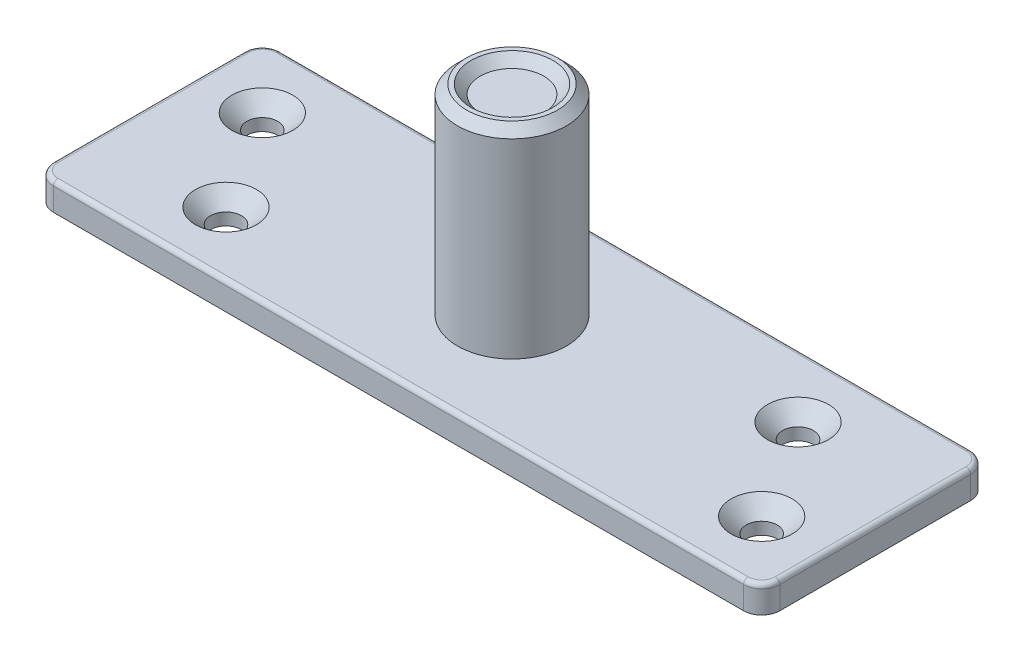
ISO-10303-21;
HEADER;
FILE_DESCRIPTION(('STEP AP214'),'2;1');
FILE_NAME('part.step','',(''),(''),'','','');
FILE_SCHEMA(('AUTOMOTIVE_DESIGN { 1 0 10303 214 1 1 1 1 }'));
ENDSEC;
DATA;
#1=APPLICATION_CONTEXT('core data for automotive mechanical design processes');
#2=APPLICATION_PROTOCOL_DEFINITION('international standard','automotive_design',2000,#1);
#3=PRODUCT_CONTEXT('',#1,'mechanical');
#4=PRODUCT('Part','Part','',(#3));
#5=PRODUCT_RELATED_PRODUCT_CATEGORY('part','',(#4));
#6=PRODUCT_DEFINITION_FORMATION('','',#4);
#7=PRODUCT_DEFINITION_CONTEXT('part definition',#1,'design');
#8=PRODUCT_DEFINITION('design','',#6,#7);
#9=PRODUCT_DEFINITION_SHAPE('','',#8);
#10=(LENGTH_UNIT() NAMED_UNIT(*) SI_UNIT(.MILLI.,.METRE.));
#11=(NAMED_UNIT(*) PLANE_ANGLE_UNIT() SI_UNIT($,.RADIAN.));
#12=(NAMED_UNIT(*) SI_UNIT($,.STERADIAN.) SOLID_ANGLE_UNIT());
#13=UNCERTAINTY_MEASURE_WITH_UNIT(LENGTH_MEASURE(1.E-05),#10,'distance_accuracy_value','');
#14=(GEOMETRIC_REPRESENTATION_CONTEXT(3) GLOBAL_UNCERTAINTY_ASSIGNED_CONTEXT((#13)) GLOBAL_UNIT_ASSIGNED_CONTEXT((#10,
#11,#12)) REPRESENTATION_CONTEXT('',''));
#15=CARTESIAN_POINT('',(0.,0.,0.));
#16=DIRECTION('',(0.,0.,1.));
#17=DIRECTION('',(1.,0.,0.));
#18=AXIS2_PLACEMENT_3D('',#15,#16,#17);
#19=CARTESIAN_POINT('',(0.,23.5,0.));
#20=DIRECTION('',(0.,-1.,0.));
#21=DIRECTION('',(0.,0.,-1.));
#22=AXIS2_PLACEMENT_3D('',#19,#20,#21);
#23=CYLINDRICAL_SURFACE('',#22,6.);
#24=CARTESIAN_POINT('',(0.,-0.5,0.));
#25=DIRECTION('',(0.,-1.,0.));
#26=DIRECTION('',(0.,0.,-1.));
#27=AXIS2_PLACEMENT_3D('',#24,#25,#26);
#28=CIRCLE('',#27,6.);
#29=CARTESIAN_POINT('',(0.,-0.5,-6.));
#30=VERTEX_POINT('',#29);
#31=EDGE_CURVE('E64',#30,#30,#28,.F.);
#32=ORIENTED_EDGE('',*,*,#31,.T.);
#33=EDGE_LOOP('',(#32));
#34=FACE_BOUND('',#33,.T.);
#35=CARTESIAN_POINT('',(0.,22.5,0.));
#36=DIRECTION('',(0.,-1.,0.));
#37=DIRECTION('',(0.,0.,-1.));
#38=AXIS2_PLACEMENT_3D('',#35,#36,#37);
#39=CIRCLE('',#38,6.);
#40=CARTESIAN_POINT('',(0.,22.5,-6.));
#41=VERTEX_POINT('',#40);
#42=EDGE_CURVE('E68',#41,#41,#39,.T.);
#43=ORIENTED_EDGE('',*,*,#42,.T.);
#44=EDGE_LOOP('',(#43));
#45=FACE_BOUND('',#44,.T.);
#46=ADVANCED_FACE('F52',(#34,#45),#23,.T.);
#47=CARTESIAN_POINT('',(0.,23.5,0.));
#48=DIRECTION('',(0.,-1.,0.));
#49=DIRECTION('',(0.,0.,-1.));
#50=AXIS2_PLACEMENT_3D('',#47,#48,#49);
#51=PLANE('',#50);
#52=CARTESIAN_POINT('',(0.,23.5,0.));
#53=DIRECTION('',(0.,1.,0.));
#54=DIRECTION('',(0.,0.,1.));
#55=AXIS2_PLACEMENT_3D('',#52,#53,#54);
#56=CIRCLE('',#55,4.5);
#57=CARTESIAN_POINT('',(0.,23.5,4.5));
#58=VERTEX_POINT('',#57);
#59=EDGE_CURVE('E76',#58,#58,#56,.T.);
#60=ORIENTED_EDGE('',*,*,#59,.F.);
#61=EDGE_LOOP('',(#60));
#62=FACE_BOUND('',#61,.T.);
#63=CARTESIAN_POINT('',(0.,23.5,0.));
#64=DIRECTION('',(0.,-1.,0.));
#65=DIRECTION('',(0.,0.,-1.));
#66=AXIS2_PLACEMENT_3D('',#63,#64,#65);
#67=CIRCLE('',#66,5.);
#68=CARTESIAN_POINT('',(0.,23.5,-5.));
#69=VERTEX_POINT('',#68);
#70=EDGE_CURVE('E60',#69,#69,#67,.F.);
#71=ORIENTED_EDGE('',*,*,#70,.T.);
#72=EDGE_LOOP('',(#71));
#73=FACE_BOUND('',#72,.T.);
#74=ADVANCED_FACE('F82',(#62,#73),#51,.F.);
#75=CARTESIAN_POINT('',(0.,-1.5,0.));
#76=DIRECTION('',(0.,-1.,0.));
#77=DIRECTION('',(0.,0.,-1.));
#78=AXIS2_PLACEMENT_3D('',#75,#76,#77);
#79=PLANE('',#78);
#80=CARTESIAN_POINT('',(0.,-1.5,0.));
#81=DIRECTION('',(0.,-1.,0.));
#82=DIRECTION('',(0.,0.,-1.));
#83=AXIS2_PLACEMENT_3D('',#80,#81,#82);
#84=CIRCLE('',#83,5.00000000000001);
#85=CARTESIAN_POINT('',(0.,-1.5,-5.00000000000001));
#86=VERTEX_POINT('',#85);
#87=EDGE_CURVE('E73',#86,#86,#84,.T.);
#88=ORIENTED_EDGE('',*,*,#87,.T.);
#89=EDGE_LOOP('',(#88));
#90=FACE_BOUND('',#89,.T.);
#91=ADVANCED_FACE('F84',(#90),#79,.T.);
#92=CARTESIAN_POINT('',(0.,-1.5,0.));
#93=DIRECTION('',(0.,1.,0.));
#94=DIRECTION('',(0.,0.,1.));
#95=AXIS2_PLACEMENT_3D('',#92,#93,#94);
#96=CONICAL_SURFACE('',#95,5.,0.785398163397446);
#97=ORIENTED_EDGE('',*,*,#31,.F.);
#98=EDGE_LOOP('',(#97));
#99=FACE_BOUND('',#98,.T.);
#100=ORIENTED_EDGE('',*,*,#87,.F.);
#101=EDGE_LOOP('',(#100));
#102=FACE_BOUND('',#101,.T.);
#103=ADVANCED_FACE('F90',(#99,#102),#96,.T.);
#104=CARTESIAN_POINT('',(0.,22.5,0.));
#105=DIRECTION('',(0.,-1.,0.));
#106=DIRECTION('',(0.,0.,-1.));
#107=AXIS2_PLACEMENT_3D('',#104,#105,#106);
#108=CONICAL_SURFACE('',#107,6.,0.785398163397451);
#109=ORIENTED_EDGE('',*,*,#70,.F.);
#110=EDGE_LOOP('',(#109));
#111=FACE_BOUND('',#110,.T.);
#112=ORIENTED_EDGE('',*,*,#42,.F.);
#113=EDGE_LOOP('',(#112));
#114=FACE_BOUND('',#113,.T.);
#115=ADVANCED_FACE('F103',(#111,#114),#108,.T.);
#116=CARTESIAN_POINT('',(0.,22.5,0.));
#117=DIRECTION('',(0.,1.,0.));
#118=DIRECTION('',(0.,0.,1.));
#119=AXIS2_PLACEMENT_3D('',#116,#117,#118);
#120=PLANE('',#119);
#121=CARTESIAN_POINT('',(0.,22.5,0.));
#122=DIRECTION('',(0.,1.,0.));
#123=DIRECTION('',(0.,0.,1.));
#124=AXIS2_PLACEMENT_3D('',#121,#122,#123);
#125=CIRCLE('',#124,3.49999999999999);
#126=CARTESIAN_POINT('',(0.,22.5,3.49999999999999));
#127=VERTEX_POINT('',#126);
#128=EDGE_CURVE('E11',#127,#127,#125,.T.);
#129=ORIENTED_EDGE('',*,*,#128,.T.);
#130=EDGE_LOOP('',(#129));
#131=FACE_BOUND('',#130,.T.);
#132=ADVANCED_FACE('F96',(#131),#120,.T.);
#133=CARTESIAN_POINT('',(0.,22.5,0.));
#134=DIRECTION('',(0.,1.,0.));
#135=DIRECTION('',(0.,0.,1.));
#136=AXIS2_PLACEMENT_3D('',#133,#134,#135);
#137=CONICAL_SURFACE('',#136,3.49999999999999,0.785398163397452);
#138=ORIENTED_EDGE('',*,*,#59,.T.);
#139=EDGE_LOOP('',(#138));
#140=FACE_BOUND('',#139,.T.);
#141=ORIENTED_EDGE('',*,*,#128,.F.);
#142=EDGE_LOOP('',(#141));
#143=FACE_BOUND('',#142,.T.);
#144=ADVANCED_FACE('F55',(#140,#143),#137,.F.);
#145=CLOSED_SHELL('',(#46,#74,#91,#103,#115,#132,#144));
#146=MANIFOLD_SOLID_BREP('B2',#145);
#147=CARTESIAN_POINT('',(0.,1.5,0.));
#148=DIRECTION('',(0.,-1.,0.));
#149=DIRECTION('',(0.,0.,-1.));
#150=AXIS2_PLACEMENT_3D('',#147,#148,#149);
#151=PLANE('',#150);
#152=DIRECTION('',(0.,0.,1.));
#153=VECTOR('',#152,1.);
#154=CARTESIAN_POINT('',(-39.5,1.5,0.));
#155=LINE('',#154,#153);
#156=CARTESIAN_POINT('',(-39.5,1.5,-10.5));
#157=VERTEX_POINT('',#156);
#158=CARTESIAN_POINT('',(-39.5,1.5,10.5));
#159=VERTEX_POINT('',#158);
#160=EDGE_CURVE('E334',#157,#159,#155,.T.);
#161=ORIENTED_EDGE('',*,*,#160,.T.);
#162=CARTESIAN_POINT('',(-38.,1.5,10.5));
#163=DIRECTION('',(0.,-1.,0.));
#164=DIRECTION('',(0.,0.,-1.));
#165=AXIS2_PLACEMENT_3D('',#162,#163,#164);
#166=CIRCLE('',#165,1.5);
#167=CARTESIAN_POINT('',(-38.,1.5,12.));
#168=VERTEX_POINT('',#167);
#169=EDGE_CURVE('E336',#159,#168,#166,.F.);
#170=ORIENTED_EDGE('',*,*,#169,.T.);
#171=DIRECTION('',(1.,0.,0.));
#172=VECTOR('',#171,1.);
#173=CARTESIAN_POINT('',(0.,1.5,12.));
#174=LINE('',#173,#172);
#175=CARTESIAN_POINT('',(38.,1.5,12.));
#176=VERTEX_POINT('',#175);
#177=EDGE_CURVE('E322',#168,#176,#174,.T.);
#178=ORIENTED_EDGE('',*,*,#177,.T.);
#179=CARTESIAN_POINT('',(38.,1.5,10.5));
#180=DIRECTION('',(0.,-1.,0.));
#181=DIRECTION('',(0.,0.,-1.));
#182=AXIS2_PLACEMENT_3D('',#179,#180,#181);
#183=CIRCLE('',#182,1.5);
#184=CARTESIAN_POINT('',(39.5,1.5,10.5));
#185=VERTEX_POINT('',#184);
#186=EDGE_CURVE('E324',#176,#185,#183,.F.);
#187=ORIENTED_EDGE('',*,*,#186,.T.);
#188=DIRECTION('',(0.,0.,-1.));
#189=VECTOR('',#188,1.);
#190=CARTESIAN_POINT('',(39.5,1.5,0.));
#191=LINE('',#190,#189);
#192=CARTESIAN_POINT('',(39.5,1.5,-10.5));
#193=VERTEX_POINT('',#192);
#194=EDGE_CURVE('E326',#185,#193,#191,.T.);
#195=ORIENTED_EDGE('',*,*,#194,.T.);
#196=CARTESIAN_POINT('',(38.,1.5,-10.5));
#197=DIRECTION('',(0.,-1.,0.));
#198=DIRECTION('',(0.,0.,-1.));
#199=AXIS2_PLACEMENT_3D('',#196,#197,#198);
#200=CIRCLE('',#199,1.5);
#201=CARTESIAN_POINT('',(38.,1.5,-12.));
#202=VERTEX_POINT('',#201);
#203=EDGE_CURVE('E328',#193,#202,#200,.F.);
#204=ORIENTED_EDGE('',*,*,#203,.T.);
#205=DIRECTION('',(-1.,0.,0.));
#206=VECTOR('',#205,1.);
#207=CARTESIAN_POINT('',(0.,1.5,-12.));
#208=LINE('',#207,#206);
#209=CARTESIAN_POINT('',(-38.,1.5,-12.));
#210=VERTEX_POINT('',#209);
#211=EDGE_CURVE('E330',#202,#210,#208,.T.);
#212=ORIENTED_EDGE('',*,*,#211,.T.);
#213=CARTESIAN_POINT('',(-38.,1.5,-10.5));
#214=DIRECTION('',(0.,-1.,0.));
#215=DIRECTION('',(0.,0.,-1.));
#216=AXIS2_PLACEMENT_3D('',#213,#214,#215);
#217=CIRCLE('',#216,1.5);
#218=EDGE_CURVE('E332',#210,#157,#217,.F.);
#219=ORIENTED_EDGE('',*,*,#218,.T.);
#220=EDGE_LOOP('',(#161,#170,#178,#187,#195,#204,#212,#219));
#221=FACE_BOUND('',#220,.T.);
#222=CARTESIAN_POINT('',(-33.,1.5,-5.5));
#223=DIRECTION('',(0.,1.,0.));
#224=DIRECTION('',(0.,0.,1.));
#225=AXIS2_PLACEMENT_3D('',#222,#223,#224);
#226=CIRCLE('',#225,3.36);
#227=CARTESIAN_POINT('',(-33.,1.5,-2.14));
#228=VERTEX_POINT('',#227);
#229=EDGE_CURVE('E372',#228,#228,#226,.T.);
#230=ORIENTED_EDGE('',*,*,#229,.F.);
#231=EDGE_LOOP('',(#230));
#232=FACE_BOUND('',#231,.T.);
#233=CARTESIAN_POINT('',(-26.,1.5,5.5));
#234=DIRECTION('',(0.,1.,0.));
#235=DIRECTION('',(0.,0.,1.));
#236=AXIS2_PLACEMENT_3D('',#233,#234,#235);
#237=CIRCLE('',#236,3.36);
#238=CARTESIAN_POINT('',(-26.,1.5,8.86));
#239=VERTEX_POINT('',#238);
#240=EDGE_CURVE('E387',#239,#239,#237,.T.);
#241=ORIENTED_EDGE('',*,*,#240,.F.);
#242=EDGE_LOOP('',(#241));
#243=FACE_BOUND('',#242,.T.);
#244=CARTESIAN_POINT('',(26.,1.5,-5.5));
#245=DIRECTION('',(0.,1.,0.));
#246=DIRECTION('',(0.,0.,1.));
#247=AXIS2_PLACEMENT_3D('',#244,#245,#246);
#248=CIRCLE('',#247,3.36);
#249=CARTESIAN_POINT('',(26.,1.5,-2.14));
#250=VERTEX_POINT('',#249);
#251=EDGE_CURVE('E396',#250,#250,#248,.T.);
#252=ORIENTED_EDGE('',*,*,#251,.F.);
#253=EDGE_LOOP('',(#252));
#254=FACE_BOUND('',#253,.T.);
#255=CARTESIAN_POINT('',(33.,1.5,5.5));
#256=DIRECTION('',(0.,1.,0.));
#257=DIRECTION('',(0.,0.,1.));
#258=AXIS2_PLACEMENT_3D('',#255,#256,#257);
#259=CIRCLE('',#258,3.36);
#260=CARTESIAN_POINT('',(33.,1.5,8.86));
#261=VERTEX_POINT('',#260);
#262=EDGE_CURVE('E405',#261,#261,#259,.T.);
#263=ORIENTED_EDGE('',*,*,#262,.F.);
#264=EDGE_LOOP('',(#263));
#265=FACE_BOUND('',#264,.T.);
#266=CARTESIAN_POINT('',(0.,1.5,0.));
#267=DIRECTION('',(0.,1.,0.));
#268=DIRECTION('',(0.,0.,1.));
#269=AXIS2_PLACEMENT_3D('',#266,#267,#268);
#270=CIRCLE('',#269,6.);
#271=CARTESIAN_POINT('',(0.,1.5,6.));
#272=VERTEX_POINT('',#271);
#273=EDGE_CURVE('E301',#272,#272,#270,.T.);
#274=ORIENTED_EDGE('',*,*,#273,.F.);
#275=EDGE_LOOP('',(#274));
#276=FACE_BOUND('',#275,.T.);
#277=ADVANCED_FACE('F175',(#221,#232,#243,#254,#265,#276),#151,.F.);
#278=CARTESIAN_POINT('',(0.,-1.5,0.));
#279=DIRECTION('',(0.,-1.,0.));
#280=DIRECTION('',(0.,0.,-1.));
#281=AXIS2_PLACEMENT_3D('',#278,#279,#280);
#282=PLANE('',#281);
#283=CARTESIAN_POINT('',(-33.,-1.5,-5.5));
#284=DIRECTION('',(0.,1.,0.));
#285=DIRECTION('',(0.,0.,1.));
#286=AXIS2_PLACEMENT_3D('',#283,#284,#285);
#287=CIRCLE('',#286,1.7);
#288=CARTESIAN_POINT('',(-33.,-1.5,-3.8));
#289=VERTEX_POINT('',#288);
#290=EDGE_CURVE('E382',#289,#289,#287,.T.);
#291=ORIENTED_EDGE('',*,*,#290,.T.);
#292=EDGE_LOOP('',(#291));
#293=FACE_BOUND('',#292,.T.);
#294=CARTESIAN_POINT('',(-26.,-1.5,5.5));
#295=DIRECTION('',(0.,1.,0.));
#296=DIRECTION('',(0.,0.,1.));
#297=AXIS2_PLACEMENT_3D('',#294,#295,#296);
#298=CIRCLE('',#297,1.7);
#299=CARTESIAN_POINT('',(-26.,-1.5,7.2));
#300=VERTEX_POINT('',#299);
#301=EDGE_CURVE('E393',#300,#300,#298,.T.);
#302=ORIENTED_EDGE('',*,*,#301,.T.);
#303=EDGE_LOOP('',(#302));
#304=FACE_BOUND('',#303,.T.);
#305=CARTESIAN_POINT('',(26.,-1.5,-5.5));
#306=DIRECTION('',(0.,1.,0.));
#307=DIRECTION('',(0.,0.,1.));
#308=AXIS2_PLACEMENT_3D('',#305,#306,#307);
#309=CIRCLE('',#308,1.7);
#310=CARTESIAN_POINT('',(26.,-1.5,-3.8));
#311=VERTEX_POINT('',#310);
#312=EDGE_CURVE('E402',#311,#311,#309,.T.);
#313=ORIENTED_EDGE('',*,*,#312,.T.);
#314=EDGE_LOOP('',(#313));
#315=FACE_BOUND('',#314,.T.);
#316=CARTESIAN_POINT('',(33.,-1.5,5.5));
#317=DIRECTION('',(0.,1.,0.));
#318=DIRECTION('',(0.,0.,1.));
#319=AXIS2_PLACEMENT_3D('',#316,#317,#318);
#320=CIRCLE('',#319,1.7);
#321=CARTESIAN_POINT('',(33.,-1.5,7.2));
#322=VERTEX_POINT('',#321);
#323=EDGE_CURVE('E411',#322,#322,#320,.T.);
#324=ORIENTED_EDGE('',*,*,#323,.T.);
#325=EDGE_LOOP('',(#324));
#326=FACE_BOUND('',#325,.T.);
#327=DIRECTION('',(-1.,0.,0.));
#328=VECTOR('',#327,1.);
#329=CARTESIAN_POINT('',(-40.,-1.5,-12.5));
#330=LINE('',#329,#328);
#331=CARTESIAN_POINT('',(38.,-1.5,-12.5));
#332=VERTEX_POINT('',#331);
#333=CARTESIAN_POINT('',(-38.,-1.5,-12.5));
#334=VERTEX_POINT('',#333);
#335=EDGE_CURVE('E271',#332,#334,#330,.T.);
#336=ORIENTED_EDGE('',*,*,#335,.F.);
#337=CARTESIAN_POINT('',(38.,-1.5,-10.5));
#338=DIRECTION('',(0.,-1.,0.));
#339=DIRECTION('',(0.,0.,-1.));
#340=AXIS2_PLACEMENT_3D('',#337,#338,#339);
#341=CIRCLE('',#340,2.);
#342=CARTESIAN_POINT('',(40.,-1.5,-10.5));
#343=VERTEX_POINT('',#342);
#344=EDGE_CURVE('E281',#332,#343,#341,.T.);
#345=ORIENTED_EDGE('',*,*,#344,.T.);
#346=DIRECTION('',(0.,0.,-1.));
#347=VECTOR('',#346,1.);
#348=CARTESIAN_POINT('',(40.,-1.5,12.5));
#349=LINE('',#348,#347);
#350=CARTESIAN_POINT('',(40.,-1.5,10.5));
#351=VERTEX_POINT('',#350);
#352=EDGE_CURVE('E296',#351,#343,#349,.T.);
#353=ORIENTED_EDGE('',*,*,#352,.F.);
#354=CARTESIAN_POINT('',(38.,-1.5,10.5));
#355=DIRECTION('',(0.,-1.,0.));
#356=DIRECTION('',(0.,0.,-1.));
#357=AXIS2_PLACEMENT_3D('',#354,#355,#356);
#358=CIRCLE('',#357,2.);
#359=CARTESIAN_POINT('',(38.,-1.5,12.5));
#360=VERTEX_POINT('',#359);
#361=EDGE_CURVE('E288',#351,#360,#358,.T.);
#362=ORIENTED_EDGE('',*,*,#361,.T.);
#363=DIRECTION('',(1.,0.,0.));
#364=VECTOR('',#363,1.);
#365=CARTESIAN_POINT('',(-40.,-1.5,12.5));
#366=LINE('',#365,#364);
#367=CARTESIAN_POINT('',(-38.,-1.5,12.5));
#368=VERTEX_POINT('',#367);
#369=EDGE_CURVE('E299',#368,#360,#366,.T.);
#370=ORIENTED_EDGE('',*,*,#369,.F.);
#371=CARTESIAN_POINT('',(-38.,-1.5,10.5));
#372=DIRECTION('',(0.,-1.,0.));
#373=DIRECTION('',(0.,0.,-1.));
#374=AXIS2_PLACEMENT_3D('',#371,#372,#373);
#375=CIRCLE('',#374,2.);
#376=CARTESIAN_POINT('',(-40.,-1.5,10.5));
#377=VERTEX_POINT('',#376);
#378=EDGE_CURVE('E277',#368,#377,#375,.T.);
#379=ORIENTED_EDGE('',*,*,#378,.T.);
#380=DIRECTION('',(0.,0.,1.));
#381=VECTOR('',#380,1.);
#382=CARTESIAN_POINT('',(-40.,-1.5,12.5));
#383=LINE('',#382,#381);
#384=CARTESIAN_POINT('',(-40.,-1.5,-10.5));
#385=VERTEX_POINT('',#384);
#386=EDGE_CURVE('E295',#385,#377,#383,.T.);
#387=ORIENTED_EDGE('',*,*,#386,.F.);
#388=CARTESIAN_POINT('',(-38.,-1.5,-10.5));
#389=DIRECTION('',(0.,-1.,0.));
#390=DIRECTION('',(0.,0.,-1.));
#391=AXIS2_PLACEMENT_3D('',#388,#389,#390);
#392=CIRCLE('',#391,2.);
#393=EDGE_CURVE('E294',#385,#334,#392,.T.);
#394=ORIENTED_EDGE('',*,*,#393,.T.);
#395=EDGE_LOOP('',(#336,#345,#353,#362,#370,#379,#387,#394));
#396=FACE_BOUND('',#395,.T.);
#397=CARTESIAN_POINT('',(0.,-1.5,0.));
#398=DIRECTION('',(0.,1.,0.));
#399=DIRECTION('',(0.,0.,1.));
#400=AXIS2_PLACEMENT_3D('',#397,#398,#399);
#401=CIRCLE('',#400,6.);
#402=CARTESIAN_POINT('',(0.,-1.5,6.));
#403=VERTEX_POINT('',#402);
#404=EDGE_CURVE('E414',#403,#403,#401,.T.);
#405=ORIENTED_EDGE('',*,*,#404,.T.);
#406=EDGE_LOOP('',(#405));
#407=FACE_BOUND('',#406,.T.);
#408=ADVANCED_FACE('F290',(#293,#304,#315,#326,#396,#407),#282,.T.);
#409=CARTESIAN_POINT('',(40.,1.5,12.5));
#410=DIRECTION('',(-1.,0.,0.));
#411=DIRECTION('',(0.,0.,1.));
#412=AXIS2_PLACEMENT_3D('',#409,#410,#411);
#413=PLANE('',#412);
#414=DIRECTION('',(0.,-1.,0.));
#415=VECTOR('',#414,1.);
#416=CARTESIAN_POINT('',(40.,1.5,-10.5));
#417=LINE('',#416,#415);
#418=CARTESIAN_POINT('',(40.,1.,-10.5));
#419=VERTEX_POINT('',#418);
#420=EDGE_CURVE('E283',#343,#419,#417,.F.);
#421=ORIENTED_EDGE('',*,*,#420,.T.);
#422=DIRECTION('',(0.,0.,-1.));
#423=VECTOR('',#422,1.);
#424=CARTESIAN_POINT('',(40.,1.,12.5));
#425=LINE('',#424,#423);
#426=CARTESIAN_POINT('',(40.,1.,10.5));
#427=VERTEX_POINT('',#426);
#428=EDGE_CURVE('E199',#419,#427,#425,.F.);
#429=ORIENTED_EDGE('',*,*,#428,.T.);
#430=DIRECTION('',(0.,-1.,0.));
#431=VECTOR('',#430,1.);
#432=CARTESIAN_POINT('',(40.,1.5,10.5));
#433=LINE('',#432,#431);
#434=EDGE_CURVE('E287',#427,#351,#433,.T.);
#435=ORIENTED_EDGE('',*,*,#434,.T.);
#436=ORIENTED_EDGE('',*,*,#352,.T.);
#437=EDGE_LOOP('',(#421,#429,#435,#436));
#438=FACE_BOUND('',#437,.T.);
#439=ADVANCED_FACE('F441',(#438),#413,.F.);
#440=CARTESIAN_POINT('',(-40.,1.5,-12.5));
#441=DIRECTION('',(0.,0.,1.));
#442=DIRECTION('',(1.,0.,0.));
#443=AXIS2_PLACEMENT_3D('',#440,#441,#442);
#444=PLANE('',#443);
#445=DIRECTION('',(0.,-1.,0.));
#446=VECTOR('',#445,1.);
#447=CARTESIAN_POINT('',(-38.,1.5,-12.5));
#448=LINE('',#447,#446);
#449=CARTESIAN_POINT('',(-38.,1.,-12.5));
#450=VERTEX_POINT('',#449);
#451=EDGE_CURVE('E278',#334,#450,#448,.F.);
#452=ORIENTED_EDGE('',*,*,#451,.T.);
#453=DIRECTION('',(-1.,0.,0.));
#454=VECTOR('',#453,1.);
#455=CARTESIAN_POINT('',(-40.,1.,-12.5));
#456=LINE('',#455,#454);
#457=CARTESIAN_POINT('',(38.,1.,-12.5));
#458=VERTEX_POINT('',#457);
#459=EDGE_CURVE('E274',#450,#458,#456,.F.);
#460=ORIENTED_EDGE('',*,*,#459,.T.);
#461=DIRECTION('',(0.,-1.,0.));
#462=VECTOR('',#461,1.);
#463=CARTESIAN_POINT('',(38.,1.5,-12.5));
#464=LINE('',#463,#462);
#465=EDGE_CURVE('E266',#458,#332,#464,.T.);
#466=ORIENTED_EDGE('',*,*,#465,.T.);
#467=ORIENTED_EDGE('',*,*,#335,.T.);
#468=EDGE_LOOP('',(#452,#460,#466,#467));
#469=FACE_BOUND('',#468,.T.);
#470=ADVANCED_FACE('F269',(#469),#444,.F.);
#471=CARTESIAN_POINT('',(-40.,1.5,12.5));
#472=DIRECTION('',(1.,0.,0.));
#473=DIRECTION('',(0.,0.,-1.));
#474=AXIS2_PLACEMENT_3D('',#471,#472,#473);
#475=PLANE('',#474);
#476=DIRECTION('',(0.,-1.,0.));
#477=VECTOR('',#476,1.);
#478=CARTESIAN_POINT('',(-40.,1.5,10.5));
#479=LINE('',#478,#477);
#480=CARTESIAN_POINT('',(-40.,1.,10.5));
#481=VERTEX_POINT('',#480);
#482=EDGE_CURVE('E317',#377,#481,#479,.F.);
#483=ORIENTED_EDGE('',*,*,#482,.T.);
#484=DIRECTION('',(0.,0.,1.));
#485=VECTOR('',#484,1.);
#486=CARTESIAN_POINT('',(-40.,1.,12.5));
#487=LINE('',#486,#485);
#488=CARTESIAN_POINT('',(-40.,1.,-10.5));
#489=VERTEX_POINT('',#488);
#490=EDGE_CURVE('E342',#481,#489,#487,.F.);
#491=ORIENTED_EDGE('',*,*,#490,.T.);
#492=DIRECTION('',(0.,-1.,0.));
#493=VECTOR('',#492,1.);
#494=CARTESIAN_POINT('',(-40.,1.5,-10.5));
#495=LINE('',#494,#493);
#496=EDGE_CURVE('E320',#489,#385,#495,.T.);
#497=ORIENTED_EDGE('',*,*,#496,.T.);
#498=ORIENTED_EDGE('',*,*,#386,.T.);
#499=EDGE_LOOP('',(#483,#491,#497,#498));
#500=FACE_BOUND('',#499,.T.);
#501=ADVANCED_FACE('F432',(#500),#475,.F.);
#502=CARTESIAN_POINT('',(-40.,1.5,12.5));
#503=DIRECTION('',(0.,0.,-1.));
#504=DIRECTION('',(-1.,0.,0.));
#505=AXIS2_PLACEMENT_3D('',#502,#503,#504);
#506=PLANE('',#505);
#507=DIRECTION('',(0.,-1.,0.));
#508=VECTOR('',#507,1.);
#509=CARTESIAN_POINT('',(38.,1.5,12.5));
#510=LINE('',#509,#508);
#511=CARTESIAN_POINT('',(38.,1.,12.5));
#512=VERTEX_POINT('',#511);
#513=EDGE_CURVE('E315',#360,#512,#510,.F.);
#514=ORIENTED_EDGE('',*,*,#513,.T.);
#515=DIRECTION('',(1.,0.,0.));
#516=VECTOR('',#515,1.);
#517=CARTESIAN_POINT('',(-40.,1.,12.5));
#518=LINE('',#517,#516);
#519=CARTESIAN_POINT('',(-38.,1.,12.5));
#520=VERTEX_POINT('',#519);
#521=EDGE_CURVE('E50',#512,#520,#518,.F.);
#522=ORIENTED_EDGE('',*,*,#521,.T.);
#523=DIRECTION('',(0.,-1.,0.));
#524=VECTOR('',#523,1.);
#525=CARTESIAN_POINT('',(-38.,1.5,12.5));
#526=LINE('',#525,#524);
#527=EDGE_CURVE('E313',#520,#368,#526,.T.);
#528=ORIENTED_EDGE('',*,*,#527,.T.);
#529=ORIENTED_EDGE('',*,*,#369,.T.);
#530=EDGE_LOOP('',(#514,#522,#528,#529));
#531=FACE_BOUND('',#530,.T.);
#532=ADVANCED_FACE('F422',(#531),#506,.F.);
#533=CARTESIAN_POINT('',(0.,1.5,0.));
#534=DIRECTION('',(0.,-1.,0.));
#535=DIRECTION('',(0.,0.,-1.));
#536=AXIS2_PLACEMENT_3D('',#533,#534,#535);
#537=CYLINDRICAL_SURFACE('',#536,6.);
#538=ORIENTED_EDGE('',*,*,#273,.T.);
#539=EDGE_LOOP('',(#538));
#540=FACE_BOUND('',#539,.T.);
#541=ORIENTED_EDGE('',*,*,#404,.F.);
#542=EDGE_LOOP('',(#541));
#543=FACE_BOUND('',#542,.T.);
#544=ADVANCED_FACE('F419',(#540,#543),#537,.F.);
#545=CARTESIAN_POINT('',(33.,1.5,5.5));
#546=DIRECTION('',(0.,1.,0.));
#547=DIRECTION('',(0.,0.,1.));
#548=AXIS2_PLACEMENT_3D('',#545,#546,#547);
#549=CYLINDRICAL_SURFACE('',#548,1.7);
#550=ORIENTED_EDGE('',*,*,#323,.F.);
#551=EDGE_LOOP('',(#550));
#552=FACE_BOUND('',#551,.T.);
#553=CARTESIAN_POINT('',(33.,-0.160000000000001,5.5));
#554=DIRECTION('',(0.,1.,0.));
#555=DIRECTION('',(0.,0.,1.));
#556=AXIS2_PLACEMENT_3D('',#553,#554,#555);
#557=CIRCLE('',#556,1.7);
#558=CARTESIAN_POINT('',(33.,-0.160000000000001,7.2));
#559=VERTEX_POINT('',#558);
#560=EDGE_CURVE('E408',#559,#559,#557,.T.);
#561=ORIENTED_EDGE('',*,*,#560,.T.);
#562=EDGE_LOOP('',(#561));
#563=FACE_BOUND('',#562,.T.);
#564=ADVANCED_FACE('F421',(#552,#563),#549,.F.);
#565=CARTESIAN_POINT('',(33.,1.5,5.5));
#566=DIRECTION('',(0.,1.,0.));
#567=DIRECTION('',(0.,0.,1.));
#568=AXIS2_PLACEMENT_3D('',#565,#566,#567);
#569=CONICAL_SURFACE('',#568,3.36,0.785398163397448);
#570=ORIENTED_EDGE('',*,*,#560,.F.);
#571=EDGE_LOOP('',(#570));
#572=FACE_BOUND('',#571,.T.);
#573=ORIENTED_EDGE('',*,*,#262,.T.);
#574=EDGE_LOOP('',(#573));
#575=FACE_BOUND('',#574,.T.);
#576=ADVANCED_FACE('F429',(#572,#575),#569,.F.);
#577=CARTESIAN_POINT('',(26.,1.5,-5.5));
#578=DIRECTION('',(0.,1.,0.));
#579=DIRECTION('',(0.,0.,1.));
#580=AXIS2_PLACEMENT_3D('',#577,#578,#579);
#581=CYLINDRICAL_SURFACE('',#580,1.7);
#582=ORIENTED_EDGE('',*,*,#312,.F.);
#583=EDGE_LOOP('',(#582));
#584=FACE_BOUND('',#583,.T.);
#585=CARTESIAN_POINT('',(26.,-0.160000000000001,-5.5));
#586=DIRECTION('',(0.,1.,0.));
#587=DIRECTION('',(0.,0.,1.));
#588=AXIS2_PLACEMENT_3D('',#585,#586,#587);
#589=CIRCLE('',#588,1.7);
#590=CARTESIAN_POINT('',(26.,-0.160000000000001,-3.8));
#591=VERTEX_POINT('',#590);
#592=EDGE_CURVE('E399',#591,#591,#589,.T.);
#593=ORIENTED_EDGE('',*,*,#592,.T.);
#594=EDGE_LOOP('',(#593));
#595=FACE_BOUND('',#594,.T.);
#596=ADVANCED_FACE('F575',(#584,#595),#581,.F.);
#597=CARTESIAN_POINT('',(26.,1.5,-5.5));
#598=DIRECTION('',(0.,1.,0.));
#599=DIRECTION('',(0.,0.,1.));
#600=AXIS2_PLACEMENT_3D('',#597,#598,#599);
#601=CONICAL_SURFACE('',#600,3.36,0.785398163397448);
#602=ORIENTED_EDGE('',*,*,#592,.F.);
#603=EDGE_LOOP('',(#602));
#604=FACE_BOUND('',#603,.T.);
#605=ORIENTED_EDGE('',*,*,#251,.T.);
#606=EDGE_LOOP('',(#605));
#607=FACE_BOUND('',#606,.T.);
#608=ADVANCED_FACE('F567',(#604,#607),#601,.F.);
#609=CARTESIAN_POINT('',(-26.,1.5,5.5));
#610=DIRECTION('',(0.,1.,0.));
#611=DIRECTION('',(0.,0.,1.));
#612=AXIS2_PLACEMENT_3D('',#609,#610,#611);
#613=CYLINDRICAL_SURFACE('',#612,1.7);
#614=ORIENTED_EDGE('',*,*,#301,.F.);
#615=EDGE_LOOP('',(#614));
#616=FACE_BOUND('',#615,.T.);
#617=CARTESIAN_POINT('',(-26.,-0.160000000000001,5.5));
#618=DIRECTION('',(0.,1.,0.));
#619=DIRECTION('',(0.,0.,1.));
#620=AXIS2_PLACEMENT_3D('',#617,#618,#619);
#621=CIRCLE('',#620,1.7);
#622=CARTESIAN_POINT('',(-26.,-0.160000000000001,7.2));
#623=VERTEX_POINT('',#622);
#624=EDGE_CURVE('E390',#623,#623,#621,.T.);
#625=ORIENTED_EDGE('',*,*,#624,.T.);
#626=EDGE_LOOP('',(#625));
#627=FACE_BOUND('',#626,.T.);
#628=ADVANCED_FACE('F559',(#616,#627),#613,.F.);
#629=CARTESIAN_POINT('',(-26.,1.5,5.5));
#630=DIRECTION('',(0.,1.,0.));
#631=DIRECTION('',(0.,0.,1.));
#632=AXIS2_PLACEMENT_3D('',#629,#630,#631);
#633=CONICAL_SURFACE('',#632,3.36,0.785398163397448);
#634=ORIENTED_EDGE('',*,*,#624,.F.);
#635=EDGE_LOOP('',(#634));
#636=FACE_BOUND('',#635,.T.);
#637=ORIENTED_EDGE('',*,*,#240,.T.);
#638=EDGE_LOOP('',(#637));
#639=FACE_BOUND('',#638,.T.);
#640=ADVANCED_FACE('F551',(#636,#639),#633,.F.);
#641=CARTESIAN_POINT('',(-33.,1.5,-5.5));
#642=DIRECTION('',(0.,1.,0.));
#643=DIRECTION('',(0.,0.,1.));
#644=AXIS2_PLACEMENT_3D('',#641,#642,#643);
#645=CYLINDRICAL_SURFACE('',#644,1.7);
#646=ORIENTED_EDGE('',*,*,#290,.F.);
#647=EDGE_LOOP('',(#646));
#648=FACE_BOUND('',#647,.T.);
#649=CARTESIAN_POINT('',(-33.,-0.160000000000001,-5.5));
#650=DIRECTION('',(0.,1.,0.));
#651=DIRECTION('',(0.,0.,1.));
#652=AXIS2_PLACEMENT_3D('',#649,#650,#651);
#653=CIRCLE('',#652,1.7);
#654=CARTESIAN_POINT('',(-33.,-0.160000000000001,-3.8));
#655=VERTEX_POINT('',#654);
#656=EDGE_CURVE('E377',#655,#655,#653,.T.);
#657=ORIENTED_EDGE('',*,*,#656,.T.);
#658=EDGE_LOOP('',(#657));
#659=FACE_BOUND('',#658,.T.);
#660=ADVANCED_FACE('F542',(#648,#659),#645,.F.);
#661=CARTESIAN_POINT('',(-33.,1.5,-5.5));
#662=DIRECTION('',(0.,1.,0.));
#663=DIRECTION('',(0.,0.,1.));
#664=AXIS2_PLACEMENT_3D('',#661,#662,#663);
#665=CONICAL_SURFACE('',#664,3.36,0.785398163397448);
#666=ORIENTED_EDGE('',*,*,#656,.F.);
#667=EDGE_LOOP('',(#666));
#668=FACE_BOUND('',#667,.T.);
#669=ORIENTED_EDGE('',*,*,#229,.T.);
#670=EDGE_LOOP('',(#669));
#671=FACE_BOUND('',#670,.T.);
#672=ADVANCED_FACE('F456',(#668,#671),#665,.F.);
#673=CARTESIAN_POINT('',(38.,1.5,-10.5));
#674=DIRECTION('',(0.,-1.,0.));
#675=DIRECTION('',(0.,0.,-1.));
#676=AXIS2_PLACEMENT_3D('',#673,#674,#675);
#677=CYLINDRICAL_SURFACE('',#676,2.);
#678=ORIENTED_EDGE('',*,*,#465,.F.);
#679=CARTESIAN_POINT('',(38.,1.,-10.5));
#680=DIRECTION('',(0.,-1.,0.));
#681=DIRECTION('',(0.,0.,-1.));
#682=AXIS2_PLACEMENT_3D('',#679,#680,#681);
#683=CIRCLE('',#682,2.);
#684=EDGE_CURVE('E347',#458,#419,#683,.T.);
#685=ORIENTED_EDGE('',*,*,#684,.T.);
#686=ORIENTED_EDGE('',*,*,#420,.F.);
#687=ORIENTED_EDGE('',*,*,#344,.F.);
#688=EDGE_LOOP('',(#678,#685,#686,#687));
#689=FACE_BOUND('',#688,.T.);
#690=ADVANCED_FACE('F282',(#689),#677,.T.);
#691=CARTESIAN_POINT('',(38.,1.5,10.5));
#692=DIRECTION('',(0.,-1.,0.));
#693=DIRECTION('',(0.,0.,-1.));
#694=AXIS2_PLACEMENT_3D('',#691,#692,#693);
#695=CYLINDRICAL_SURFACE('',#694,2.);
#696=ORIENTED_EDGE('',*,*,#434,.F.);
#697=CARTESIAN_POINT('',(38.,1.,10.5));
#698=DIRECTION('',(0.,-1.,0.));
#699=DIRECTION('',(0.,0.,-1.));
#700=AXIS2_PLACEMENT_3D('',#697,#698,#699);
#701=CIRCLE('',#700,2.);
#702=EDGE_CURVE('E184',#427,#512,#701,.T.);
#703=ORIENTED_EDGE('',*,*,#702,.T.);
#704=ORIENTED_EDGE('',*,*,#513,.F.);
#705=ORIENTED_EDGE('',*,*,#361,.F.);
#706=EDGE_LOOP('',(#696,#703,#704,#705));
#707=FACE_BOUND('',#706,.T.);
#708=ADVANCED_FACE('F455',(#707),#695,.T.);
#709=CARTESIAN_POINT('',(-38.,1.5,-10.5));
#710=DIRECTION('',(0.,-1.,0.));
#711=DIRECTION('',(0.,0.,-1.));
#712=AXIS2_PLACEMENT_3D('',#709,#710,#711);
#713=CYLINDRICAL_SURFACE('',#712,2.);
#714=ORIENTED_EDGE('',*,*,#496,.F.);
#715=CARTESIAN_POINT('',(-38.,1.,-10.5));
#716=DIRECTION('',(0.,-1.,0.));
#717=DIRECTION('',(0.,0.,-1.));
#718=AXIS2_PLACEMENT_3D('',#715,#716,#717);
#719=CIRCLE('',#718,2.);
#720=EDGE_CURVE('E344',#489,#450,#719,.T.);
#721=ORIENTED_EDGE('',*,*,#720,.T.);
#722=ORIENTED_EDGE('',*,*,#451,.F.);
#723=ORIENTED_EDGE('',*,*,#393,.F.);
#724=EDGE_LOOP('',(#714,#721,#722,#723));
#725=FACE_BOUND('',#724,.T.);
#726=ADVANCED_FACE('F459',(#725),#713,.T.);
#727=CARTESIAN_POINT('',(-38.,1.5,10.5));
#728=DIRECTION('',(0.,-1.,0.));
#729=DIRECTION('',(0.,0.,-1.));
#730=AXIS2_PLACEMENT_3D('',#727,#728,#729);
#731=CYLINDRICAL_SURFACE('',#730,2.);
#732=ORIENTED_EDGE('',*,*,#527,.F.);
#733=CARTESIAN_POINT('',(-38.,1.,10.5));
#734=DIRECTION('',(0.,-1.,0.));
#735=DIRECTION('',(0.,0.,-1.));
#736=AXIS2_PLACEMENT_3D('',#733,#734,#735);
#737=CIRCLE('',#736,2.);
#738=EDGE_CURVE('E339',#520,#481,#737,.T.);
#739=ORIENTED_EDGE('',*,*,#738,.T.);
#740=ORIENTED_EDGE('',*,*,#482,.F.);
#741=ORIENTED_EDGE('',*,*,#378,.F.);
#742=EDGE_LOOP('',(#732,#739,#740,#741));
#743=FACE_BOUND('',#742,.T.);
#744=ADVANCED_FACE('F462',(#743),#731,.T.);
#745=CARTESIAN_POINT('',(38.,1.,-10.5));
#746=DIRECTION('',(0.,-1.,0.));
#747=DIRECTION('',(0.,0.,-1.));
#748=AXIS2_PLACEMENT_3D('',#745,#746,#747);
#749=TOROIDAL_SURFACE('',#748,1.5,0.5);
#750=CARTESIAN_POINT('',(39.5,1.,-10.5));
#751=DIRECTION('',(0.,0.,1.));
#752=DIRECTION('',(1.,0.,0.));
#753=AXIS2_PLACEMENT_3D('',#750,#751,#752);
#754=CIRCLE('',#753,0.5);
#755=EDGE_CURVE('E366',#419,#193,#754,.T.);
#756=ORIENTED_EDGE('',*,*,#755,.F.);
#757=ORIENTED_EDGE('',*,*,#684,.F.);
#758=CARTESIAN_POINT('',(38.,1.,-12.));
#759=DIRECTION('',(-1.,0.,0.));
#760=DIRECTION('',(0.,0.,1.));
#761=AXIS2_PLACEMENT_3D('',#758,#759,#760);
#762=CIRCLE('',#761,0.5);
#763=EDGE_CURVE('E179',#202,#458,#762,.T.);
#764=ORIENTED_EDGE('',*,*,#763,.F.);
#765=ORIENTED_EDGE('',*,*,#203,.F.);
#766=EDGE_LOOP('',(#756,#757,#764,#765));
#767=FACE_BOUND('',#766,.T.);
#768=ADVANCED_FACE('F177',(#767),#749,.T.);
#769=CARTESIAN_POINT('',(0.,1.,-12.));
#770=DIRECTION('',(-1.,0.,0.));
#771=DIRECTION('',(0.,0.,1.));
#772=AXIS2_PLACEMENT_3D('',#769,#770,#771);
#773=CYLINDRICAL_SURFACE('',#772,0.5);
#774=ORIENTED_EDGE('',*,*,#763,.T.);
#775=ORIENTED_EDGE('',*,*,#459,.F.);
#776=CARTESIAN_POINT('',(-38.,1.,-12.));
#777=DIRECTION('',(-1.,0.,0.));
#778=DIRECTION('',(0.,0.,1.));
#779=AXIS2_PLACEMENT_3D('',#776,#777,#778);
#780=CIRCLE('',#779,0.5);
#781=EDGE_CURVE('E364',#210,#450,#780,.T.);
#782=ORIENTED_EDGE('',*,*,#781,.F.);
#783=ORIENTED_EDGE('',*,*,#211,.F.);
#784=EDGE_LOOP('',(#774,#775,#782,#783));
#785=FACE_BOUND('',#784,.T.);
#786=ADVANCED_FACE('F489',(#785),#773,.T.);
#787=CARTESIAN_POINT('',(39.5,1.,0.));
#788=DIRECTION('',(0.,0.,-1.));
#789=DIRECTION('',(-1.,0.,0.));
#790=AXIS2_PLACEMENT_3D('',#787,#788,#789);
#791=CYLINDRICAL_SURFACE('',#790,0.5);
#792=ORIENTED_EDGE('',*,*,#755,.T.);
#793=ORIENTED_EDGE('',*,*,#194,.F.);
#794=CARTESIAN_POINT('',(39.5,1.,10.5));
#795=DIRECTION('',(0.,0.,1.));
#796=DIRECTION('',(1.,0.,0.));
#797=AXIS2_PLACEMENT_3D('',#794,#795,#796);
#798=CIRCLE('',#797,0.5);
#799=EDGE_CURVE('E361',#427,#185,#798,.T.);
#800=ORIENTED_EDGE('',*,*,#799,.F.);
#801=ORIENTED_EDGE('',*,*,#428,.F.);
#802=EDGE_LOOP('',(#792,#793,#800,#801));
#803=FACE_BOUND('',#802,.T.);
#804=ADVANCED_FACE('F486',(#803),#791,.T.);
#805=CARTESIAN_POINT('',(-38.,1.,-10.5));
#806=DIRECTION('',(0.,-1.,0.));
#807=DIRECTION('',(0.,0.,-1.));
#808=AXIS2_PLACEMENT_3D('',#805,#806,#807);
#809=TOROIDAL_SURFACE('',#808,1.5,0.5);
#810=ORIENTED_EDGE('',*,*,#781,.T.);
#811=ORIENTED_EDGE('',*,*,#720,.F.);
#812=CARTESIAN_POINT('',(-39.5,1.,-10.5));
#813=DIRECTION('',(0.,0.,1.));
#814=DIRECTION('',(1.,0.,0.));
#815=AXIS2_PLACEMENT_3D('',#812,#813,#814);
#816=CIRCLE('',#815,0.5);
#817=EDGE_CURVE('E358',#157,#489,#816,.T.);
#818=ORIENTED_EDGE('',*,*,#817,.F.);
#819=ORIENTED_EDGE('',*,*,#218,.F.);
#820=EDGE_LOOP('',(#810,#811,#818,#819));
#821=FACE_BOUND('',#820,.T.);
#822=ADVANCED_FACE('F482',(#821),#809,.T.);
#823=CARTESIAN_POINT('',(38.,1.,10.5));
#824=DIRECTION('',(0.,-1.,0.));
#825=DIRECTION('',(0.,0.,-1.));
#826=AXIS2_PLACEMENT_3D('',#823,#824,#825);
#827=TOROIDAL_SURFACE('',#826,1.5,0.5);
#828=ORIENTED_EDGE('',*,*,#799,.T.);
#829=ORIENTED_EDGE('',*,*,#186,.F.);
#830=CARTESIAN_POINT('',(38.,1.,12.));
#831=DIRECTION('',(-1.,0.,0.));
#832=DIRECTION('',(0.,0.,1.));
#833=AXIS2_PLACEMENT_3D('',#830,#831,#832);
#834=CIRCLE('',#833,0.5);
#835=EDGE_CURVE('E355',#512,#176,#834,.T.);
#836=ORIENTED_EDGE('',*,*,#835,.F.);
#837=ORIENTED_EDGE('',*,*,#702,.F.);
#838=EDGE_LOOP('',(#828,#829,#836,#837));
#839=FACE_BOUND('',#838,.T.);
#840=ADVANCED_FACE('F478',(#839),#827,.T.);
#841=CARTESIAN_POINT('',(-39.5,1.,0.));
#842=DIRECTION('',(0.,0.,1.));
#843=DIRECTION('',(1.,0.,0.));
#844=AXIS2_PLACEMENT_3D('',#841,#842,#843);
#845=CYLINDRICAL_SURFACE('',#844,0.5);
#846=ORIENTED_EDGE('',*,*,#817,.T.);
#847=ORIENTED_EDGE('',*,*,#490,.F.);
#848=CARTESIAN_POINT('',(-39.5,1.,10.5));
#849=DIRECTION('',(0.,0.,1.));
#850=DIRECTION('',(1.,0.,0.));
#851=AXIS2_PLACEMENT_3D('',#848,#849,#850);
#852=CIRCLE('',#851,0.5);
#853=EDGE_CURVE('E353',#159,#481,#852,.T.);
#854=ORIENTED_EDGE('',*,*,#853,.F.);
#855=ORIENTED_EDGE('',*,*,#160,.F.);
#856=EDGE_LOOP('',(#846,#847,#854,#855));
#857=FACE_BOUND('',#856,.T.);
#858=ADVANCED_FACE('F474',(#857),#845,.T.);
#859=CARTESIAN_POINT('',(0.,1.,12.));
#860=DIRECTION('',(1.,0.,0.));
#861=DIRECTION('',(0.,0.,-1.));
#862=AXIS2_PLACEMENT_3D('',#859,#860,#861);
#863=CYLINDRICAL_SURFACE('',#862,0.5);
#864=ORIENTED_EDGE('',*,*,#835,.T.);
#865=ORIENTED_EDGE('',*,*,#177,.F.);
#866=CARTESIAN_POINT('',(-38.,1.,12.));
#867=DIRECTION('',(-1.,0.,0.));
#868=DIRECTION('',(0.,0.,1.));
#869=AXIS2_PLACEMENT_3D('',#866,#867,#868);
#870=CIRCLE('',#869,0.5);
#871=EDGE_CURVE('E351',#520,#168,#870,.T.);
#872=ORIENTED_EDGE('',*,*,#871,.F.);
#873=ORIENTED_EDGE('',*,*,#521,.F.);
#874=EDGE_LOOP('',(#864,#865,#872,#873));
#875=FACE_BOUND('',#874,.T.);
#876=ADVANCED_FACE('F470',(#875),#863,.T.);
#877=CARTESIAN_POINT('',(-38.,1.,10.5));
#878=DIRECTION('',(0.,-1.,0.));
#879=DIRECTION('',(0.,0.,-1.));
#880=AXIS2_PLACEMENT_3D('',#877,#878,#879);
#881=TOROIDAL_SURFACE('',#880,1.5,0.5);
#882=ORIENTED_EDGE('',*,*,#853,.T.);
#883=ORIENTED_EDGE('',*,*,#738,.F.);
#884=ORIENTED_EDGE('',*,*,#871,.T.);
#885=ORIENTED_EDGE('',*,*,#169,.F.);
#886=EDGE_LOOP('',(#882,#883,#884,#885));
#887=FACE_BOUND('',#886,.T.);
#888=ADVANCED_FACE('F467',(#887),#881,.T.);
#889=CLOSED_SHELL('',(#277,#408,#439,#470,#501,#532,#544,#564,#576,#596,#608,#628,#640,#660,
#672,#690,#708,#726,#744,#768,#786,#804,#822,#840,#858,#876,#888));
#890=MANIFOLD_SOLID_BREP('B6',#889);
#891=ADVANCED_BREP_SHAPE_REPRESENTATION('',(#18,#146,#890),#14);
#892=SHAPE_DEFINITION_REPRESENTATION(#9,#891);
ENDSEC;
END-ISO-10303-21;
